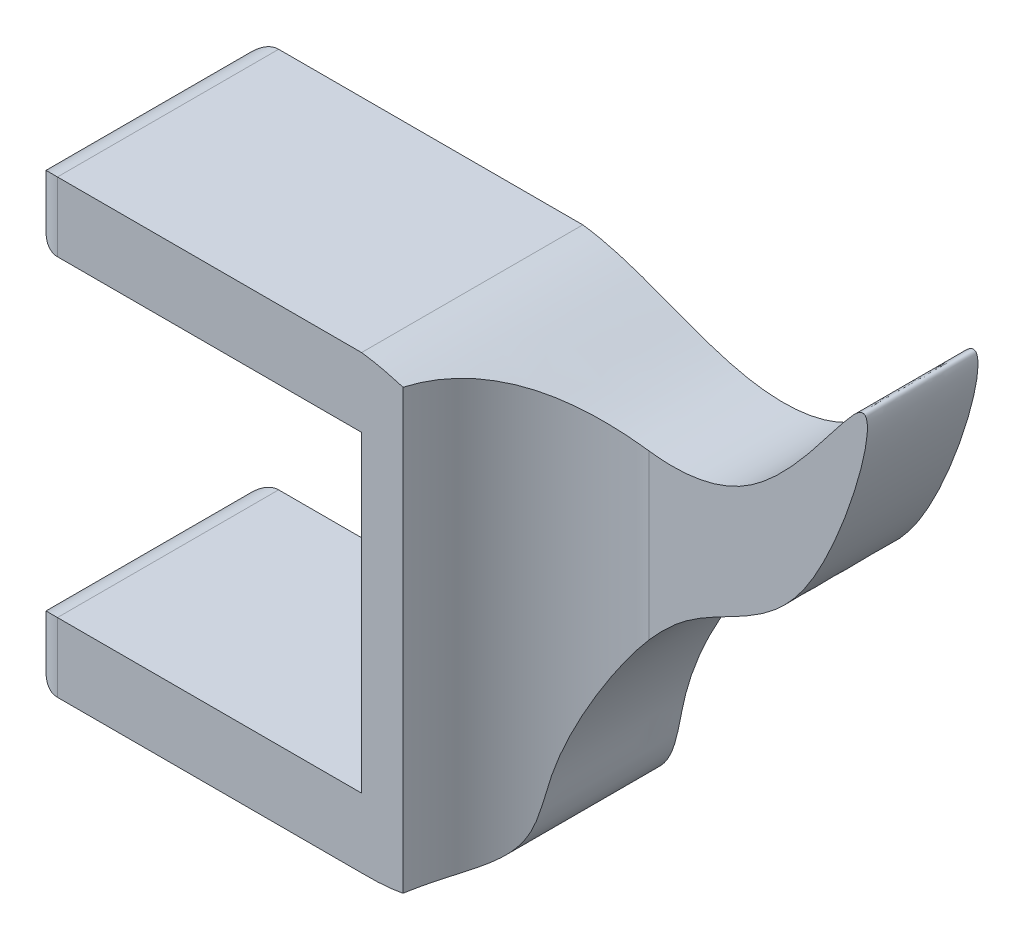
ISO-10303-21;
HEADER;
FILE_DESCRIPTION(('STEP AP214'),'2;1');
FILE_NAME('part.step','',(''),(''),'','','');
FILE_SCHEMA(('AUTOMOTIVE_DESIGN { 1 0 10303 214 1 1 1 1 }'));
ENDSEC;
DATA;
#1=APPLICATION_CONTEXT('core data for automotive mechanical design processes');
#2=APPLICATION_PROTOCOL_DEFINITION('international standard','automotive_design',2000,#1);
#3=PRODUCT_CONTEXT('',#1,'mechanical');
#4=PRODUCT('Part','Part','',(#3));
#5=PRODUCT_RELATED_PRODUCT_CATEGORY('part','',(#4));
#6=PRODUCT_DEFINITION_FORMATION('','',#4);
#7=PRODUCT_DEFINITION_CONTEXT('part definition',#1,'design');
#8=PRODUCT_DEFINITION('design','',#6,#7);
#9=PRODUCT_DEFINITION_SHAPE('','',#8);
#10=(LENGTH_UNIT() NAMED_UNIT(*) SI_UNIT(.MILLI.,.METRE.));
#11=(NAMED_UNIT(*) PLANE_ANGLE_UNIT() SI_UNIT($,.RADIAN.));
#12=(NAMED_UNIT(*) SI_UNIT($,.STERADIAN.) SOLID_ANGLE_UNIT());
#13=UNCERTAINTY_MEASURE_WITH_UNIT(LENGTH_MEASURE(1.E-05),#10,'distance_accuracy_value','');
#14=(GEOMETRIC_REPRESENTATION_CONTEXT(3) GLOBAL_UNCERTAINTY_ASSIGNED_CONTEXT((#13)) GLOBAL_UNIT_ASSIGNED_CONTEXT((#10,
#11,#12)) REPRESENTATION_CONTEXT('',''));
#15=CARTESIAN_POINT('',(0.,0.,0.));
#16=DIRECTION('',(0.,0.,1.));
#17=DIRECTION('',(1.,0.,0.));
#18=AXIS2_PLACEMENT_3D('',#15,#16,#17);
#19=CARTESIAN_POINT('',(0.,0.,8.));
#20=DIRECTION('',(1.,0.,0.));
#21=DIRECTION('',(0.,0.,-1.));
#22=AXIS2_PLACEMENT_3D('',#19,#20,#21);
#23=PLANE('',#22);
#24=DIRECTION('',(0.,-1.,0.));
#25=VECTOR('',#24,1.);
#26=CARTESIAN_POINT('',(0.,2.5,7.));
#27=LINE('',#26,#25);
#28=CARTESIAN_POINT('',(0.,1.,7.));
#29=VERTEX_POINT('',#28);
#30=CARTESIAN_POINT('',(0.,1.5,7.));
#31=VERTEX_POINT('',#30);
#32=EDGE_CURVE('E223',#29,#31,#27,.F.);
#33=ORIENTED_EDGE('',*,*,#32,.T.);
#34=DIRECTION('',(0.,0.,-1.));
#35=VECTOR('',#34,1.);
#36=CARTESIAN_POINT('',(0.,1.5,8.));
#37=LINE('',#36,#35);
#38=CARTESIAN_POINT('',(0.,1.5,1.));
#39=VERTEX_POINT('',#38);
#40=EDGE_CURVE('E226',#31,#39,#37,.T.);
#41=ORIENTED_EDGE('',*,*,#40,.T.);
#42=DIRECTION('',(0.,-1.,0.));
#43=VECTOR('',#42,1.);
#44=CARTESIAN_POINT('',(0.,0.,1.));
#45=LINE('',#44,#43);
#46=CARTESIAN_POINT('',(0.,1.,1.));
#47=VERTEX_POINT('',#46);
#48=EDGE_CURVE('E217',#39,#47,#45,.T.);
#49=ORIENTED_EDGE('',*,*,#48,.T.);
#50=DIRECTION('',(0.,0.,-1.));
#51=VECTOR('',#50,1.);
#52=CARTESIAN_POINT('',(0.,1.,8.));
#53=LINE('',#52,#51);
#54=EDGE_CURVE('E220',#47,#29,#53,.F.);
#55=ORIENTED_EDGE('',*,*,#54,.T.);
#56=EDGE_LOOP('',(#33,#41,#49,#55));
#57=FACE_BOUND('',#56,.T.);
#58=ADVANCED_FACE('F39',(#57),#23,.F.);
#59=CARTESIAN_POINT('',(0.,0.,8.));
#60=DIRECTION('',(0.,1.,0.));
#61=DIRECTION('',(0.,0.,1.));
#62=AXIS2_PLACEMENT_3D('',#59,#60,#61);
#63=PLANE('',#62);
#64=DIRECTION('',(1.,0.,0.));
#65=VECTOR('',#64,1.);
#66=CARTESIAN_POINT('',(0.,0.,8.));
#67=LINE('',#66,#65);
#68=CARTESIAN_POINT('',(1.,0.,8.));
#69=VERTEX_POINT('',#68);
#70=CARTESIAN_POINT('',(12.,0.,8.));
#71=VERTEX_POINT('',#70);
#72=EDGE_CURVE('E329',#69,#71,#67,.T.);
#73=ORIENTED_EDGE('',*,*,#72,.F.);
#74=DIRECTION('',(0.,0.,-1.));
#75=VECTOR('',#74,1.);
#76=CARTESIAN_POINT('',(1.,0.,8.));
#77=LINE('',#76,#75);
#78=CARTESIAN_POINT('',(1.,0.,0.));
#79=VERTEX_POINT('',#78);
#80=EDGE_CURVE('E234',#69,#79,#77,.T.);
#81=ORIENTED_EDGE('',*,*,#80,.T.);
#82=DIRECTION('',(1.,0.,0.));
#83=VECTOR('',#82,1.);
#84=CARTESIAN_POINT('',(0.,0.,0.));
#85=LINE('',#84,#83);
#86=CARTESIAN_POINT('',(12.5,0.,0.));
#87=VERTEX_POINT('',#86);
#88=EDGE_CURVE('E253',#79,#87,#85,.T.);
#89=ORIENTED_EDGE('',*,*,#88,.T.);
#90=CARTESIAN_POINT('',(12.5,0.,0.5));
#91=DIRECTION('',(0.,1.,0.));
#92=DIRECTION('',(0.,0.,1.));
#93=AXIS2_PLACEMENT_3D('',#90,#91,#92);
#94=CIRCLE('',#93,0.5);
#95=CARTESIAN_POINT('',(12.,0.,0.5));
#96=VERTEX_POINT('',#95);
#97=EDGE_CURVE('E278',#87,#96,#94,.T.);
#98=ORIENTED_EDGE('',*,*,#97,.T.);
#99=DIRECTION('',(0.,0.,-1.));
#100=VECTOR('',#99,1.);
#101=CARTESIAN_POINT('',(12.,0.,8.));
#102=LINE('',#101,#100);
#103=EDGE_CURVE('E170',#71,#96,#102,.T.);
#104=ORIENTED_EDGE('',*,*,#103,.F.);
#105=EDGE_LOOP('',(#73,#81,#89,#98,#104));
#106=FACE_BOUND('',#105,.T.);
#107=ADVANCED_FACE('F393',(#106),#63,.F.);
#108=CARTESIAN_POINT('',(12.,0.,8.));
#109=DIRECTION('',(1.,0.,0.));
#110=DIRECTION('',(0.,0.,-1.));
#111=AXIS2_PLACEMENT_3D('',#108,#109,#110);
#112=PLANE('',#111);
#113=ORIENTED_EDGE('',*,*,#103,.T.);
#114=DIRECTION('',(0.,-1.,0.));
#115=VECTOR('',#114,1.);
#116=CARTESIAN_POINT('',(12.,0.,0.5));
#117=LINE('',#116,#115);
#118=CARTESIAN_POINT('',(12.,-11.3,0.5));
#119=VERTEX_POINT('',#118);
#120=EDGE_CURVE('E237',#96,#119,#117,.T.);
#121=ORIENTED_EDGE('',*,*,#120,.T.);
#122=DIRECTION('',(0.,0.,-1.));
#123=VECTOR('',#122,1.);
#124=CARTESIAN_POINT('',(12.,-11.3,8.));
#125=LINE('',#124,#123);
#126=CARTESIAN_POINT('',(12.,-11.3,8.));
#127=VERTEX_POINT('',#126);
#128=EDGE_CURVE('E177',#127,#119,#125,.T.);
#129=ORIENTED_EDGE('',*,*,#128,.F.);
#130=DIRECTION('',(0.,-1.,0.));
#131=VECTOR('',#130,1.);
#132=CARTESIAN_POINT('',(12.,0.,8.));
#133=LINE('',#132,#131);
#134=EDGE_CURVE('E346',#71,#127,#133,.T.);
#135=ORIENTED_EDGE('',*,*,#134,.F.);
#136=EDGE_LOOP('',(#113,#121,#129,#135));
#137=FACE_BOUND('',#136,.T.);
#138=ADVANCED_FACE('F345',(#137),#112,.F.);
#139=CARTESIAN_POINT('',(12.,-11.3,8.));
#140=DIRECTION('',(0.,-1.,0.));
#141=DIRECTION('',(1.,0.,0.));
#142=AXIS2_PLACEMENT_3D('',#139,#140,#141);
#143=PLANE('',#142);
#144=DIRECTION('',(-1.,0.,0.));
#145=VECTOR('',#144,1.);
#146=CARTESIAN_POINT('',(12.,-11.3,0.));
#147=LINE('',#146,#145);
#148=CARTESIAN_POINT('',(12.5,-11.3,0.));
#149=VERTEX_POINT('',#148);
#150=CARTESIAN_POINT('',(1.,-11.3,0.));
#151=VERTEX_POINT('',#150);
#152=EDGE_CURVE('E310',#149,#151,#147,.T.);
#153=ORIENTED_EDGE('',*,*,#152,.T.);
#154=DIRECTION('',(0.,0.,-1.));
#155=VECTOR('',#154,1.);
#156=CARTESIAN_POINT('',(1.,-11.3,8.));
#157=LINE('',#156,#155);
#158=CARTESIAN_POINT('',(1.,-11.3,8.));
#159=VERTEX_POINT('',#158);
#160=EDGE_CURVE('E198',#151,#159,#157,.F.);
#161=ORIENTED_EDGE('',*,*,#160,.T.);
#162=DIRECTION('',(-1.,0.,0.));
#163=VECTOR('',#162,1.);
#164=CARTESIAN_POINT('',(12.,-11.3,8.));
#165=LINE('',#164,#163);
#166=EDGE_CURVE('E342',#127,#159,#165,.T.);
#167=ORIENTED_EDGE('',*,*,#166,.F.);
#168=ORIENTED_EDGE('',*,*,#128,.T.);
#169=CARTESIAN_POINT('',(12.5,-11.3,0.5));
#170=DIRECTION('',(0.,-1.,0.));
#171=DIRECTION('',(1.,0.,0.));
#172=AXIS2_PLACEMENT_3D('',#169,#170,#171);
#173=CIRCLE('',#172,0.5);
#174=EDGE_CURVE('E274',#119,#149,#173,.T.);
#175=ORIENTED_EDGE('',*,*,#174,.T.);
#176=EDGE_LOOP('',(#153,#161,#167,#168,#175));
#177=FACE_BOUND('',#176,.T.);
#178=ADVANCED_FACE('F340',(#177),#143,.F.);
#179=CARTESIAN_POINT('',(0.,-11.3,8.));
#180=DIRECTION('',(1.,0.,0.));
#181=DIRECTION('',(0.,1.,0.));
#182=AXIS2_PLACEMENT_3D('',#179,#180,#181);
#183=PLANE('',#182);
#184=DIRECTION('',(0.,-1.,0.));
#185=VECTOR('',#184,1.);
#186=CARTESIAN_POINT('',(0.,-11.3,7.));
#187=LINE('',#186,#185);
#188=CARTESIAN_POINT('',(0.,-12.8,7.));
#189=VERTEX_POINT('',#188);
#190=CARTESIAN_POINT('',(0.,-12.3,7.));
#191=VERTEX_POINT('',#190);
#192=EDGE_CURVE('E191',#189,#191,#187,.F.);
#193=ORIENTED_EDGE('',*,*,#192,.T.);
#194=DIRECTION('',(0.,0.,-1.));
#195=VECTOR('',#194,1.);
#196=CARTESIAN_POINT('',(0.,-12.3,8.));
#197=LINE('',#196,#195);
#198=CARTESIAN_POINT('',(0.,-12.3,1.));
#199=VERTEX_POINT('',#198);
#200=EDGE_CURVE('E194',#191,#199,#197,.T.);
#201=ORIENTED_EDGE('',*,*,#200,.T.);
#202=DIRECTION('',(0.,-1.,0.));
#203=VECTOR('',#202,1.);
#204=CARTESIAN_POINT('',(0.,-11.3,1.));
#205=LINE('',#204,#203);
#206=CARTESIAN_POINT('',(0.,-12.8,1.));
#207=VERTEX_POINT('',#206);
#208=EDGE_CURVE('E174',#199,#207,#205,.T.);
#209=ORIENTED_EDGE('',*,*,#208,.T.);
#210=DIRECTION('',(0.,0.,-1.));
#211=VECTOR('',#210,1.);
#212=CARTESIAN_POINT('',(0.,-12.8,8.));
#213=LINE('',#212,#211);
#214=EDGE_CURVE('E188',#207,#189,#213,.F.);
#215=ORIENTED_EDGE('',*,*,#214,.T.);
#216=EDGE_LOOP('',(#193,#201,#209,#215));
#217=FACE_BOUND('',#216,.T.);
#218=ADVANCED_FACE('F371',(#217),#183,.F.);
#219=CARTESIAN_POINT('',(0.,-13.8,8.));
#220=DIRECTION('',(0.,1.,0.));
#221=DIRECTION('',(0.,0.,1.));
#222=AXIS2_PLACEMENT_3D('',#219,#220,#221);
#223=PLANE('',#222);
#224=DIRECTION('',(1.,0.,0.));
#225=VECTOR('',#224,1.);
#226=CARTESIAN_POINT('',(0.,-13.8,8.));
#227=LINE('',#226,#225);
#228=CARTESIAN_POINT('',(1.,-13.8,8.));
#229=VERTEX_POINT('',#228);
#230=CARTESIAN_POINT('',(12.,-13.8,8.));
#231=VERTEX_POINT('',#230);
#232=EDGE_CURVE('E163',#229,#231,#227,.T.);
#233=ORIENTED_EDGE('',*,*,#232,.F.);
#234=DIRECTION('',(0.,0.,-1.));
#235=VECTOR('',#234,1.);
#236=CARTESIAN_POINT('',(1.,-13.8,8.));
#237=LINE('',#236,#235);
#238=CARTESIAN_POINT('',(1.,-13.8,0.));
#239=VERTEX_POINT('',#238);
#240=EDGE_CURVE('E208',#229,#239,#237,.T.);
#241=ORIENTED_EDGE('',*,*,#240,.T.);
#242=DIRECTION('',(1.,0.,0.));
#243=VECTOR('',#242,1.);
#244=CARTESIAN_POINT('',(0.,-13.8,0.));
#245=LINE('',#244,#243);
#246=CARTESIAN_POINT('',(12.,-13.8,0.));
#247=VERTEX_POINT('',#246);
#248=EDGE_CURVE('E314',#239,#247,#245,.T.);
#249=ORIENTED_EDGE('',*,*,#248,.T.);
#250=DIRECTION('',(0.,0.,-1.));
#251=VECTOR('',#250,1.);
#252=CARTESIAN_POINT('',(12.,-13.8,8.));
#253=LINE('',#252,#251);
#254=EDGE_CURVE('E333',#231,#247,#253,.T.);
#255=ORIENTED_EDGE('',*,*,#254,.F.);
#256=EDGE_LOOP('',(#233,#241,#249,#255));
#257=FACE_BOUND('',#256,.T.);
#258=ADVANCED_FACE('F291',(#257),#223,.F.);
#259=CARTESIAN_POINT('',(12.,-13.8,8.));
#260=CARTESIAN_POINT('',(15.4847102523201,-13.8528468301209,8.));
#261=CARTESIAN_POINT('',(14.940540429152,-10.3224990222861,8.));
#262=CARTESIAN_POINT('',(19.3306872790784,-3.08840811438823,8.));
#263=CARTESIAN_POINT('',(24.4500588762761,-2.75205545765976,8.));
#264=CARTESIAN_POINT('',(27.7590084837071,9.33411750310438,8.));
#265=CARTESIAN_POINT('',(22.7397639869143,0.637931927937077,8.));
#266=CARTESIAN_POINT('',(17.1583996594228,0.302540020179991,8.));
#267=CARTESIAN_POINT('',(14.0891624826578,2.22940097290657,8.));
#268=CARTESIAN_POINT('',(12.,2.5,8.));
#269=B_SPLINE_CURVE_WITH_KNOTS('',3,(#259,#260,#261,#262,#263,#264,#265,#266,#267,#268),
.UNSPECIFIED.,.F.,.F.,(4,1,1,1,1,1,1,4),(0.,0.147276447844875,0.328233881234076,
0.48848936607897,0.668662232198369,0.788034841795962,0.87120045565876,1.),.UNSPECIFIED.);
#270=DIRECTION('',(0.,0.,-1.));
#271=VECTOR('',#270,1.);
#272=SURFACE_OF_LINEAR_EXTRUSION('',#269,#271);
#273=CARTESIAN_POINT('',(13.5000000137224,2.16422625637094,8.));
#274=VERTEX_POINT('',#273);
#275=CARTESIAN_POINT('',(12.,2.5,8.));
#276=VERTEX_POINT('',#275);
#277=EDGE_CURVE('E167',#274,#276,#269,.T.);
#278=ORIENTED_EDGE('',*,*,#277,.F.);
#279=CARTESIAN_POINT('',(13.5000000137224,2.16422625637094,8.));
#280=CARTESIAN_POINT('',(13.527177423667,2.1559474382016,7.8667599511038));
#281=CARTESIAN_POINT('',(13.5598062480283,2.14592473446505,7.73474310946525));
#282=CARTESIAN_POINT('',(13.6355746879105,2.12223453789105,7.47411105241857));
#283=CARTESIAN_POINT('',(13.6787131865118,2.10856743234925,7.34549547714862));
#284=CARTESIAN_POINT('',(13.7749779185704,2.07747395978039,7.09295175546111));
#285=CARTESIAN_POINT('',(13.8280754246414,2.06005838464433,6.9690113285852));
#286=CARTESIAN_POINT('',(13.9438234889711,2.02133226056555,6.72631216345148));
#287=CARTESIAN_POINT('',(14.0064738994083,2.00002177189168,6.60755334505006));
#288=CARTESIAN_POINT('',(14.1407516897043,1.95347114498519,6.37599253322812));
#289=CARTESIAN_POINT('',(14.212381436241,1.92822997031772,6.26319212144317));
#290=CARTESIAN_POINT('',(14.3639449279196,1.87391481943308,6.04429022146097));
#291=CARTESIAN_POINT('',(14.4438790435895,1.84484067217897,5.93818903251265));
#292=CARTESIAN_POINT('',(14.6113427386662,1.7831064815339,5.73330238932791));
#293=CARTESIAN_POINT('',(14.6988715102584,1.7504468194227,5.63451615909381));
#294=CARTESIAN_POINT('',(14.880839166275,1.68194356017544,5.44472582189096));
#295=CARTESIAN_POINT('',(14.975278194048,1.64609989698614,5.35372187644538));
#296=CARTESIAN_POINT('',(15.1732026554132,1.57073255742882,5.17737895806739));
#297=CARTESIAN_POINT('',(15.2768694918933,1.53113298578407,5.09227621152031));
#298=CARTESIAN_POINT('',(15.490188806769,1.44994906837441,4.93099281149258));
#299=CARTESIAN_POINT('',(15.5998414862946,1.40836465592291,4.85481245808356));
#300=CARTESIAN_POINT('',(15.824826545937,1.32406502888191,4.71146092967336));
#301=CARTESIAN_POINT('',(15.9401704209302,1.28134761364059,4.64430910122109));
#302=CARTESIAN_POINT('',(16.175866525876,1.1959583993154,4.51942437051432));
#303=CARTESIAN_POINT('',(16.2962189023101,1.15328660160316,4.46169174398257));
#304=CARTESIAN_POINT('',(16.5534325951706,1.0651325725778,4.35076038501276));
#305=CARTESIAN_POINT('',(16.6907634090455,1.01977880748943,4.29854343573643));
#306=CARTESIAN_POINT('',(16.9704998860226,0.932360556264356,4.20613454574612));
#307=CARTESIAN_POINT('',(17.1129071448996,0.89029711795058,4.16594642425651));
#308=CARTESIAN_POINT('',(17.4015051355064,0.811547913322285,4.09827343904451));
#309=CARTESIAN_POINT('',(17.5476775927863,0.774840432257285,4.07073624916871));
#310=CARTESIAN_POINT('',(17.8433923472349,0.70856896438915,4.02872521268173));
#311=CARTESIAN_POINT('',(17.9929307246273,0.678997095150161,4.01423690266246));
#312=CARTESIAN_POINT('',(18.1859260355537,0.64676325715664,4.00436001162303));
#313=CARTESIAN_POINT('',(18.2284500013433,0.640026251191426,4.00272703526753));
#314=CARTESIAN_POINT('',(18.3136238072751,0.627281942764177,4.00054736157709));
#315=CARTESIAN_POINT('',(18.3562736128671,0.621274456206925,4.00000038965042));
#316=CARTESIAN_POINT('',(18.3989794853852,0.615643027872547,4.));
#317=B_SPLINE_CURVE_WITH_KNOTS('',3,(#279,#280,#281,#282,#283,#284,#285,#286,#287,#288,#289,
#290,#291,#292,#293,#294,#295,#296,#297,#298,#299,#300,#301,#302,#303,#304,#305,#306,#307,#308,
#309,#310,#311,#312,#313,#314,#315,#316),.UNSPECIFIED.,.F.,.F.,(4,2,2,2,2,2,2,2,2,2,2,2,2,2,2,2,
2,2,4),(0.,0.408578126374839,0.817112849876771,1.22448676459235,1.63185437624632,
2.03932958416367,2.44682298081449,2.85427308695506,3.26173164776775,3.68083492263619,
4.09995228844456,4.51995390295257,4.9399678097158,5.40069073315524,5.86155978406703,
6.32050505859989,6.77894100886525,6.90818272967927,7.03739176809311),.UNSPECIFIED.);
#318=CARTESIAN_POINT('',(18.3989794771545,0.61564302895761,4.));
#319=VERTEX_POINT('',#318);
#320=EDGE_CURVE('E11',#274,#319,#317,.T.);
#321=ORIENTED_EDGE('',*,*,#320,.T.);
#322=CARTESIAN_POINT('',(12.,-13.8,4.));
#323=CARTESIAN_POINT('',(15.4847102523201,-13.8528468301209,4.));
#324=CARTESIAN_POINT('',(14.940540429152,-10.3224990222861,4.));
#325=CARTESIAN_POINT('',(19.3306872790784,-3.08840811438823,4.));
#326=CARTESIAN_POINT('',(24.4500588762761,-2.75205545765976,4.));
#327=CARTESIAN_POINT('',(27.7590084837071,9.33411750310438,4.));
#328=CARTESIAN_POINT('',(22.7397639869143,0.637931927937077,4.));
#329=CARTESIAN_POINT('',(17.1583996594228,0.302540020179991,4.));
#330=CARTESIAN_POINT('',(14.0891624826578,2.22940097290657,4.));
#331=CARTESIAN_POINT('',(12.,2.5,4.));
#332=B_SPLINE_CURVE_WITH_KNOTS('',3,(#322,#323,#324,#325,#326,#327,#328,#329,#330,#331),
.UNSPECIFIED.,.F.,.F.,(4,1,1,1,1,1,1,4),(0.,0.147276447844875,0.328233881234076,
0.48848936607897,0.668662232198369,0.788034841795962,0.87120045565876,1.),.UNSPECIFIED.);
#333=CARTESIAN_POINT('',(18.3989794788807,-5.29838820308295,4.));
#334=VERTEX_POINT('',#333);
#335=EDGE_CURVE('E155',#319,#334,#332,.F.);
#336=ORIENTED_EDGE('',*,*,#335,.T.);
#337=CARTESIAN_POINT('',(18.3989794855664,-5.29838820308295,4.));
#338=CARTESIAN_POINT('',(18.3039210325966,-5.40871834029973,4.00001772219593));
#339=CARTESIAN_POINT('',(18.211098963984,-5.52092115523218,4.00271078598421));
#340=CARTESIAN_POINT('',(18.0299666691016,-5.74833899040509,4.01280777244988));
#341=CARTESIAN_POINT('',(17.9416476287125,-5.86354740195227,4.02020207805254));
#342=CARTESIAN_POINT('',(17.7692406813389,-6.09660718542812,4.0390596493651));
#343=CARTESIAN_POINT('',(17.685149555651,-6.2144564449496,4.05051976454279));
#344=CARTESIAN_POINT('',(17.5210222364878,-6.45253501203465,4.0769823966913));
#345=CARTESIAN_POINT('',(17.4409856928237,-6.57276411280285,4.09198460710038));
#346=CARTESIAN_POINT('',(17.2844803503467,-6.8159787548189,4.1251337512948));
#347=CARTESIAN_POINT('',(17.2080320600542,-6.93897530705882,4.14329649058672));
#348=CARTESIAN_POINT('',(17.059079207944,-7.1869833876033,4.18226244525458));
#349=CARTESIAN_POINT('',(16.9865761570342,-7.31199566443912,4.20306666221037));
#350=CARTESIAN_POINT('',(16.8455347768711,-7.56389046211622,4.24686813278035));
#351=CARTESIAN_POINT('',(16.7769972591392,-7.69077335914857,4.26986583274469));
#352=CARTESIAN_POINT('',(16.6439633986098,-7.946297889386,4.31759559406989));
#353=CARTESIAN_POINT('',(16.5794665717292,-8.07493930965828,4.34232744692045));
#354=CARTESIAN_POINT('',(16.4566059900929,-8.32984040044568,4.39224135399812));
#355=CARTESIAN_POINT('',(16.3981122368759,-8.45604518215839,4.41738389340823));
#356=CARTESIAN_POINT('',(16.285179816453,-8.7100833632706,4.46836813124184));
#357=CARTESIAN_POINT('',(16.2307402339509,-8.83791638738895,4.49420967004771));
#358=CARTESIAN_POINT('',(16.1261264724265,-9.09531870658596,4.54606379975746));
#359=CARTESIAN_POINT('',(16.0759532723309,-9.22488839229103,4.57207642845093));
#360=CARTESIAN_POINT('',(15.9803855367852,-9.48536876663402,4.62354748409946));
#361=CARTESIAN_POINT('',(15.9349749785617,-9.61627321911792,4.649007524707));
#362=CARTESIAN_POINT('',(15.8706519014133,-9.81401575706534,4.68628060617999));
#363=CARTESIAN_POINT('',(15.8498446984313,-9.88015491925205,4.69855107741842));
#364=CARTESIAN_POINT('',(15.8095709633891,-10.0129166985362,4.72267437965749));
#365=CARTESIAN_POINT('',(15.7901044212769,-10.0795393120047,4.73452721378914));
#366=CARTESIAN_POINT('',(15.752600575547,-10.2132237242435,4.75769365959138));
#367=CARTESIAN_POINT('',(15.7345621931899,-10.2802851492985,4.76900767562573));
#368=CARTESIAN_POINT('',(15.7000498321067,-10.4149215754794,4.79093844193513));
#369=CARTESIAN_POINT('',(15.6835758171119,-10.4824965646593,4.80155520837363));
#370=CARTESIAN_POINT('',(15.6580106183437,-10.5922620381389,4.81822697720916));
#371=CARTESIAN_POINT('',(15.6484959132192,-10.6343251052583,4.82448026832522));
#372=CARTESIAN_POINT('',(15.6298862206177,-10.7185713237731,4.83679851453428));
#373=CARTESIAN_POINT('',(15.6207912326929,-10.7607544750403,4.84286346982819));
#374=CARTESIAN_POINT('',(15.5939898343788,-10.8874739538002,4.86085762544765));
#375=CARTESIAN_POINT('',(15.5767755416216,-10.9721427931812,4.87258052114523));
#376=CARTESIAN_POINT('',(15.5427681449131,-11.1416379005041,4.8960405023143));
#377=CARTESIAN_POINT('',(15.5259754187659,-11.2264642412846,4.90777759128051));
#378=CARTESIAN_POINT('',(15.4918041256159,-11.3959243656551,4.9319818610704));
#379=CARTESIAN_POINT('',(15.4744254041277,-11.4805580920886,4.94444923506744));
#380=CARTESIAN_POINT('',(15.437927806815,-11.6491326284871,4.97101955812722));
#381=CARTESIAN_POINT('',(15.418810328095,-11.7330739366819,4.98512119650174));
#382=CARTESIAN_POINT('',(15.3775129672407,-11.8996393165859,5.01610582244626));
#383=CARTESIAN_POINT('',(15.3553359885981,-11.9822645552976,5.03298617589202));
#384=CARTESIAN_POINT('',(15.3142078307359,-12.1195534255257,5.064949023961));
#385=CARTESIAN_POINT('',(15.2964419659753,-12.1748243873715,5.07892212579397));
#386=CARTESIAN_POINT('',(15.2583951299215,-12.2838295897674,5.10932843816428));
#387=CARTESIAN_POINT('',(15.2381138502883,-12.3375636409274,5.1257619503505));
#388=CARTESIAN_POINT('',(15.1948087883597,-12.4426717475032,5.16150101895685));
#389=CARTESIAN_POINT('',(15.1717964817392,-12.4940545032741,5.18079463695825));
#390=CARTESIAN_POINT('',(15.1228340255331,-12.5939953382267,5.22271150788386));
#391=CARTESIAN_POINT('',(15.0968842944099,-12.6425538182635,5.24533428667679));
#392=CARTESIAN_POINT('',(15.0417803434647,-12.7368171307524,5.29451831648161));
#393=CARTESIAN_POINT('',(15.0125863448007,-12.7824724910247,5.32113027490426));
#394=CARTESIAN_POINT('',(14.9517095867508,-12.8695875600789,5.37811295189075));
#395=CARTESIAN_POINT('',(14.9200268444575,-12.9110472976715,5.40848364464074));
#396=CARTESIAN_POINT('',(14.8547236298683,-12.9895460120567,5.47291098557733));
#397=CARTESIAN_POINT('',(14.8210985986265,-13.0265739047572,5.50697648539461));
#398=CARTESIAN_POINT('',(14.7527048974874,-13.0960799277934,5.57843186555955));
#399=CARTESIAN_POINT('',(14.7179359931751,-13.1285571182879,5.61582243002288));
#400=CARTESIAN_POINT('',(14.6419766923933,-13.1943753917638,5.70020076265874));
#401=CARTESIAN_POINT('',(14.6007041137684,-13.2269160047798,5.74773677243589));
#402=CARTESIAN_POINT('',(14.5184975873786,-13.286720120747,5.84627487361894));
#403=CARTESIAN_POINT('',(14.4775637263174,-13.3139823102515,5.89727782345972));
#404=CARTESIAN_POINT('',(14.3966631544584,-13.3640239303737,6.0023558118446));
#405=CARTESIAN_POINT('',(14.356698828366,-13.3867931312108,6.05643750781645));
#406=CARTESIAN_POINT('',(14.2783399573249,-13.4284922540395,6.16716793754434));
#407=CARTESIAN_POINT('',(14.2399459989836,-13.4474207516155,6.22381761420201));
#408=CARTESIAN_POINT('',(14.1424701385386,-13.4925624016716,6.37429760066731));
#409=CARTESIAN_POINT('',(14.0849253624516,-13.5162543558876,6.46988677240985));
#410=CARTESIAN_POINT('',(13.9758775076141,-13.5575081040095,6.66574242614701));
#411=CARTESIAN_POINT('',(13.9243781879633,-13.5750660970493,6.76601176471235));
#412=CARTESIAN_POINT('',(13.8280665560054,-13.6055689041653,6.97034280360635));
#413=CARTESIAN_POINT('',(13.7832524195053,-13.6185149780442,7.07440345971549));
#414=CARTESIAN_POINT('',(13.7007151490159,-13.640905551222,7.28560146432073));
#415=CARTESIAN_POINT('',(13.6629885472379,-13.6503517651434,7.39273727846753));
#416=CARTESIAN_POINT('',(13.603162604562,-13.66457657878,7.58312604762927));
#417=CARTESIAN_POINT('',(13.5794943328332,-13.6699316403861,7.66584822654884));
#418=CARTESIAN_POINT('',(13.5365034688604,-13.6793233206232,7.83222692627234));
#419=CARTESIAN_POINT('',(13.5171682402415,-13.6833637889711,7.91587996323462));
#420=CARTESIAN_POINT('',(13.5000000000003,-13.6868748578703,7.99999999999857));
#421=B_SPLINE_CURVE_WITH_KNOTS('',3,(#337,#338,#339,#340,#341,#342,#343,#344,#345,#346,#347,
#348,#349,#350,#351,#352,#353,#354,#355,#356,#357,#358,#359,#360,#361,#362,#363,#364,#365,#366,
#367,#368,#369,#370,#371,#372,#373,#374,#375,#376,#377,#378,#379,#380,#381,#382,#383,#384,#385,
#386,#387,#388,#389,#390,#391,#392,#393,#394,#395,#396,#397,#398,#399,#400,#401,#402,#403,#404,
#405,#406,#407,#408,#409,#410,#411,#412,#413,#414,#415,#416,#417,#418,#419,#420),.UNSPECIFIED.,
.F.,.F.,(4,2,2,2,2,2,2,2,2,2,2,2,2,2,2,2,2,2,2,2,2,2,2,2,2,2,2,2,2,2,2,2,2,2,2,2,2,2,2,2,2,4),
(0.,0.436784805682295,0.87267896672434,1.30823609529228,1.74375554101104,2.18151908834452,
2.61944912276284,3.05746846212293,3.49543522512298,3.91943386927847,4.3433364966925,
4.76733612808606,5.18986017968269,5.40108432253727,5.6123068815112,5.82336834358934,
6.03442491117136,6.16515259755628,6.29588014447485,6.55745185907962,6.81925017855971,
7.08111806383991,7.34277736451319,7.60419003488969,7.78323507994939,7.96230209412234,
8.14064167703611,8.31895588578119,8.49976664798758,8.68057616850923,8.86182884308714,
9.04311889617319,9.25538352079701,9.46770089620481,9.68049624195079,9.89337036419896,
10.235034845373,10.5769106626063,10.9186930205065,11.2603077131178,11.5188125941337,
11.7765534970975),.UNSPECIFIED.);
#422=CARTESIAN_POINT('',(13.5,-13.6868748578499,8.));
#423=VERTEX_POINT('',#422);
#424=EDGE_CURVE('E54',#334,#423,#421,.T.);
#425=ORIENTED_EDGE('',*,*,#424,.T.);
#426=EDGE_CURVE('E154',#231,#423,#269,.T.);
#427=ORIENTED_EDGE('',*,*,#426,.F.);
#428=ORIENTED_EDGE('',*,*,#254,.T.);
#429=CARTESIAN_POINT('',(12.,-13.8,0.));
#430=CARTESIAN_POINT('',(15.4847102523201,-13.8528468301209,0.));
#431=CARTESIAN_POINT('',(14.940540429152,-10.3224990222861,0.));
#432=CARTESIAN_POINT('',(19.3306872790784,-3.08840811438823,0.));
#433=CARTESIAN_POINT('',(24.4500588762761,-2.75205545765976,0.));
#434=CARTESIAN_POINT('',(27.7590084837071,9.33411750310438,0.));
#435=CARTESIAN_POINT('',(22.7397639869143,0.637931927937077,0.));
#436=CARTESIAN_POINT('',(17.1583996594228,0.302540020179991,0.));
#437=CARTESIAN_POINT('',(14.0891624826578,2.22940097290657,0.));
#438=CARTESIAN_POINT('',(12.,2.5,0.));
#439=B_SPLINE_CURVE_WITH_KNOTS('',3,(#429,#430,#431,#432,#433,#434,#435,#436,#437,#438),
.UNSPECIFIED.,.F.,.F.,(4,1,1,1,1,1,1,4),(0.,0.147276447844875,0.328233881234076,
0.48848936607897,0.668662232198369,0.788034841795962,0.87120045565876,1.),.UNSPECIFIED.);
#440=CARTESIAN_POINT('',(12.,2.5,0.));
#441=VERTEX_POINT('',#440);
#442=EDGE_CURVE('E317',#247,#441,#439,.T.);
#443=ORIENTED_EDGE('',*,*,#442,.T.);
#444=DIRECTION('',(0.,0.,-1.));
#445=VECTOR('',#444,1.);
#446=CARTESIAN_POINT('',(12.,2.5,8.));
#447=LINE('',#446,#445);
#448=EDGE_CURVE('E307',#276,#441,#447,.T.);
#449=ORIENTED_EDGE('',*,*,#448,.F.);
#450=EDGE_LOOP('',(#278,#321,#336,#425,#427,#428,#443,#449));
#451=FACE_BOUND('',#450,.T.);
#452=ADVANCED_FACE('F152',(#451),#272,.F.);
#453=CARTESIAN_POINT('',(0.,2.5,8.));
#454=DIRECTION('',(0.,-1.,0.));
#455=DIRECTION('',(0.,0.,-1.));
#456=AXIS2_PLACEMENT_3D('',#453,#454,#455);
#457=PLANE('',#456);
#458=DIRECTION('',(-1.,0.,0.));
#459=VECTOR('',#458,1.);
#460=CARTESIAN_POINT('',(0.,2.5,0.));
#461=LINE('',#460,#459);
#462=CARTESIAN_POINT('',(1.,2.5,0.));
#463=VERTEX_POINT('',#462);
#464=EDGE_CURVE('E322',#441,#463,#461,.T.);
#465=ORIENTED_EDGE('',*,*,#464,.T.);
#466=DIRECTION('',(0.,0.,-1.));
#467=VECTOR('',#466,1.);
#468=CARTESIAN_POINT('',(1.,2.5,8.));
#469=LINE('',#468,#467);
#470=CARTESIAN_POINT('',(1.,2.5,8.));
#471=VERTEX_POINT('',#470);
#472=EDGE_CURVE('E230',#463,#471,#469,.F.);
#473=ORIENTED_EDGE('',*,*,#472,.T.);
#474=DIRECTION('',(-1.,0.,0.));
#475=VECTOR('',#474,1.);
#476=CARTESIAN_POINT('',(0.,2.5,8.));
#477=LINE('',#476,#475);
#478=EDGE_CURVE('E166',#276,#471,#477,.T.);
#479=ORIENTED_EDGE('',*,*,#478,.F.);
#480=ORIENTED_EDGE('',*,*,#448,.T.);
#481=EDGE_LOOP('',(#465,#473,#479,#480));
#482=FACE_BOUND('',#481,.T.);
#483=ADVANCED_FACE('F290',(#482),#457,.F.);
#484=CARTESIAN_POINT('',(24.3495323207852,-0.363588990567902,8.));
#485=DIRECTION('',(0.,0.,1.));
#486=DIRECTION('',(1.,0.,0.));
#487=AXIS2_PLACEMENT_3D('',#484,#485,#486);
#488=PLANE('',#487);
#489=ORIENTED_EDGE('',*,*,#166,.T.);
#490=DIRECTION('',(0.,-1.,0.));
#491=VECTOR('',#490,1.);
#492=CARTESIAN_POINT('',(1.,-13.8,8.));
#493=LINE('',#492,#491);
#494=EDGE_CURVE('E205',#159,#229,#493,.T.);
#495=ORIENTED_EDGE('',*,*,#494,.T.);
#496=ORIENTED_EDGE('',*,*,#232,.T.);
#497=ORIENTED_EDGE('',*,*,#426,.T.);
#498=DIRECTION('',(0.,-1.,0.));
#499=VECTOR('',#498,1.);
#500=CARTESIAN_POINT('',(13.5,-0.363588990567902,8.));
#501=LINE('',#500,#499);
#502=EDGE_CURVE('E161',#274,#423,#501,.T.);
#503=ORIENTED_EDGE('',*,*,#502,.F.);
#504=ORIENTED_EDGE('',*,*,#277,.T.);
#505=ORIENTED_EDGE('',*,*,#478,.T.);
#506=DIRECTION('',(0.,-1.,0.));
#507=VECTOR('',#506,1.);
#508=CARTESIAN_POINT('',(1.,0.,8.));
#509=LINE('',#508,#507);
#510=EDGE_CURVE('E202',#471,#69,#509,.T.);
#511=ORIENTED_EDGE('',*,*,#510,.T.);
#512=ORIENTED_EDGE('',*,*,#72,.T.);
#513=ORIENTED_EDGE('',*,*,#134,.T.);
#514=EDGE_LOOP('',(#489,#495,#496,#497,#503,#504,#505,#511,#512,#513));
#515=FACE_BOUND('',#514,.T.);
#516=ADVANCED_FACE('F160',(#515),#488,.T.);
#517=CARTESIAN_POINT('',(24.3495323207852,-0.363588990567902,0.));
#518=DIRECTION('',(0.,0.,1.));
#519=DIRECTION('',(1.,0.,0.));
#520=AXIS2_PLACEMENT_3D('',#517,#518,#519);
#521=PLANE('',#520);
#522=ORIENTED_EDGE('',*,*,#152,.F.);
#523=DIRECTION('',(0.,-1.,0.));
#524=VECTOR('',#523,1.);
#525=CARTESIAN_POINT('',(12.5,-0.363588990567902,0.));
#526=LINE('',#525,#524);
#527=EDGE_CURVE('E270',#149,#87,#526,.F.);
#528=ORIENTED_EDGE('',*,*,#527,.T.);
#529=ORIENTED_EDGE('',*,*,#88,.F.);
#530=DIRECTION('',(0.,-1.,0.));
#531=VECTOR('',#530,1.);
#532=CARTESIAN_POINT('',(1.,-0.363588990567902,0.));
#533=LINE('',#532,#531);
#534=EDGE_CURVE('E211',#79,#463,#533,.F.);
#535=ORIENTED_EDGE('',*,*,#534,.T.);
#536=ORIENTED_EDGE('',*,*,#464,.F.);
#537=ORIENTED_EDGE('',*,*,#442,.F.);
#538=ORIENTED_EDGE('',*,*,#248,.F.);
#539=DIRECTION('',(0.,-1.,0.));
#540=VECTOR('',#539,1.);
#541=CARTESIAN_POINT('',(1.,-0.363588990567905,0.));
#542=LINE('',#541,#540);
#543=EDGE_CURVE('E214',#239,#151,#542,.F.);
#544=ORIENTED_EDGE('',*,*,#543,.T.);
#545=EDGE_LOOP('',(#522,#528,#529,#535,#536,#537,#538,#544));
#546=FACE_BOUND('',#545,.T.);
#547=ADVANCED_FACE('F354',(#546),#521,.F.);
#548=CARTESIAN_POINT('',(27.5264411120128,26.2,4.));
#549=DIRECTION('',(0.,0.,-1.));
#550=DIRECTION('',(-1.,0.,0.));
#551=AXIS2_PLACEMENT_3D('',#548,#549,#550);
#552=PLANE('',#551);
#553=ORIENTED_EDGE('',*,*,#335,.F.);
#554=DIRECTION('',(0.,1.,0.));
#555=VECTOR('',#554,1.);
#556=CARTESIAN_POINT('',(18.3989794855664,26.2,4.));
#557=LINE('',#556,#555);
#558=EDGE_CURVE('E157',#319,#334,#557,.F.);
#559=ORIENTED_EDGE('',*,*,#558,.T.);
#560=EDGE_LOOP('',(#553,#559));
#561=FACE_BOUND('',#560,.T.);
#562=ADVANCED_FACE('F382',(#561),#552,.F.);
#563=CARTESIAN_POINT('',(1.,-12.8,8.));
#564=DIRECTION('',(0.,0.,-1.));
#565=DIRECTION('',(-1.,0.,0.));
#566=AXIS2_PLACEMENT_3D('',#563,#564,#565);
#567=CYLINDRICAL_SURFACE('',#566,1.);
#568=CARTESIAN_POINT('',(1.,-12.8,1.));
#569=DIRECTION('',(0.,-0.707106781186547,0.707106781186547));
#570=DIRECTION('',(0.,-0.707106781186547,-0.707106781186547));
#571=AXIS2_PLACEMENT_3D('',#568,#569,#570);
#572=ELLIPSE('',#571,1.41421356237309,1.);
#573=EDGE_CURVE('E245',#239,#207,#572,.F.);
#574=ORIENTED_EDGE('',*,*,#573,.F.);
#575=ORIENTED_EDGE('',*,*,#240,.F.);
#576=CARTESIAN_POINT('',(1.,-12.8,7.));
#577=DIRECTION('',(0.,-0.707106781186547,-0.707106781186547));
#578=DIRECTION('',(0.,0.707106781186547,-0.707106781186547));
#579=AXIS2_PLACEMENT_3D('',#576,#577,#578);
#580=ELLIPSE('',#579,1.41421356237309,1.);
#581=EDGE_CURVE('E249',#189,#229,#580,.F.);
#582=ORIENTED_EDGE('',*,*,#581,.F.);
#583=ORIENTED_EDGE('',*,*,#214,.F.);
#584=EDGE_LOOP('',(#574,#575,#582,#583));
#585=FACE_BOUND('',#584,.T.);
#586=ADVANCED_FACE('F380',(#585),#567,.T.);
#587=CARTESIAN_POINT('',(1.,-0.363588990567905,7.));
#588=DIRECTION('',(0.,1.,0.));
#589=DIRECTION('',(-1.,0.,0.));
#590=AXIS2_PLACEMENT_3D('',#587,#588,#589);
#591=CYLINDRICAL_SURFACE('',#590,1.);
#592=ORIENTED_EDGE('',*,*,#581,.T.);
#593=ORIENTED_EDGE('',*,*,#494,.F.);
#594=CARTESIAN_POINT('',(1.,-12.3,7.));
#595=DIRECTION('',(0.,0.707106781186547,-0.707106781186547));
#596=DIRECTION('',(0.,0.707106781186547,0.707106781186547));
#597=AXIS2_PLACEMENT_3D('',#594,#595,#596);
#598=ELLIPSE('',#597,1.41421356237309,1.);
#599=EDGE_CURVE('E241',#191,#159,#598,.T.);
#600=ORIENTED_EDGE('',*,*,#599,.F.);
#601=ORIENTED_EDGE('',*,*,#192,.F.);
#602=EDGE_LOOP('',(#592,#593,#600,#601));
#603=FACE_BOUND('',#602,.T.);
#604=ADVANCED_FACE('F375',(#603),#591,.T.);
#605=CARTESIAN_POINT('',(1.,-11.3,1.));
#606=DIRECTION('',(0.,-1.,0.));
#607=DIRECTION('',(1.,0.,0.));
#608=AXIS2_PLACEMENT_3D('',#605,#606,#607);
#609=CYLINDRICAL_SURFACE('',#608,1.);
#610=ORIENTED_EDGE('',*,*,#573,.T.);
#611=ORIENTED_EDGE('',*,*,#208,.F.);
#612=CARTESIAN_POINT('',(1.,-12.3,1.));
#613=DIRECTION('',(0.,-0.707106781186547,-0.707106781186547));
#614=DIRECTION('',(0.,-0.707106781186547,0.707106781186547));
#615=AXIS2_PLACEMENT_3D('',#612,#613,#614);
#616=ELLIPSE('',#615,1.41421356237309,1.);
#617=EDGE_CURVE('E238',#151,#199,#616,.F.);
#618=ORIENTED_EDGE('',*,*,#617,.F.);
#619=ORIENTED_EDGE('',*,*,#543,.F.);
#620=EDGE_LOOP('',(#610,#611,#618,#619));
#621=FACE_BOUND('',#620,.T.);
#622=ADVANCED_FACE('F367',(#621),#609,.T.);
#623=CARTESIAN_POINT('',(1.,-12.3,8.));
#624=DIRECTION('',(0.,0.,-1.));
#625=DIRECTION('',(-1.,0.,0.));
#626=AXIS2_PLACEMENT_3D('',#623,#624,#625);
#627=CYLINDRICAL_SURFACE('',#626,1.);
#628=ORIENTED_EDGE('',*,*,#599,.T.);
#629=ORIENTED_EDGE('',*,*,#160,.F.);
#630=ORIENTED_EDGE('',*,*,#617,.T.);
#631=ORIENTED_EDGE('',*,*,#200,.F.);
#632=EDGE_LOOP('',(#628,#629,#630,#631));
#633=FACE_BOUND('',#632,.T.);
#634=ADVANCED_FACE('F361',(#633),#627,.T.);
#635=CARTESIAN_POINT('',(1.,1.,8.));
#636=DIRECTION('',(0.,0.,-1.));
#637=DIRECTION('',(-1.,0.,0.));
#638=AXIS2_PLACEMENT_3D('',#635,#636,#637);
#639=CYLINDRICAL_SURFACE('',#638,1.);
#640=CARTESIAN_POINT('',(1.,1.,1.));
#641=DIRECTION('',(0.,-0.707106781186547,0.707106781186547));
#642=DIRECTION('',(0.,-0.707106781186547,-0.707106781186547));
#643=AXIS2_PLACEMENT_3D('',#640,#641,#642);
#644=ELLIPSE('',#643,1.41421356237309,1.);
#645=EDGE_CURVE('E260',#79,#47,#644,.F.);
#646=ORIENTED_EDGE('',*,*,#645,.F.);
#647=ORIENTED_EDGE('',*,*,#80,.F.);
#648=CARTESIAN_POINT('',(1.,1.,7.));
#649=DIRECTION('',(0.,-0.707106781186547,-0.707106781186547));
#650=DIRECTION('',(0.,0.707106781186547,-0.707106781186547));
#651=AXIS2_PLACEMENT_3D('',#648,#649,#650);
#652=ELLIPSE('',#651,1.41421356237309,1.);
#653=EDGE_CURVE('E242',#29,#69,#652,.F.);
#654=ORIENTED_EDGE('',*,*,#653,.F.);
#655=ORIENTED_EDGE('',*,*,#54,.F.);
#656=EDGE_LOOP('',(#646,#647,#654,#655));
#657=FACE_BOUND('',#656,.T.);
#658=ADVANCED_FACE('F405',(#657),#639,.T.);
#659=CARTESIAN_POINT('',(1.,-0.363588990567902,7.));
#660=DIRECTION('',(0.,1.,0.));
#661=DIRECTION('',(0.,0.,1.));
#662=AXIS2_PLACEMENT_3D('',#659,#660,#661);
#663=CYLINDRICAL_SURFACE('',#662,1.);
#664=ORIENTED_EDGE('',*,*,#653,.T.);
#665=ORIENTED_EDGE('',*,*,#510,.F.);
#666=CARTESIAN_POINT('',(1.,1.5,7.));
#667=DIRECTION('',(0.,0.707106781186547,-0.707106781186547));
#668=DIRECTION('',(0.,0.707106781186547,0.707106781186547));
#669=AXIS2_PLACEMENT_3D('',#666,#667,#668);
#670=ELLIPSE('',#669,1.41421356237309,1.);
#671=EDGE_CURVE('E257',#31,#471,#670,.T.);
#672=ORIENTED_EDGE('',*,*,#671,.F.);
#673=ORIENTED_EDGE('',*,*,#32,.F.);
#674=EDGE_LOOP('',(#664,#665,#672,#673));
#675=FACE_BOUND('',#674,.T.);
#676=ADVANCED_FACE('F421',(#675),#663,.T.);
#677=CARTESIAN_POINT('',(1.,0.,1.));
#678=DIRECTION('',(0.,-1.,0.));
#679=DIRECTION('',(0.,0.,-1.));
#680=AXIS2_PLACEMENT_3D('',#677,#678,#679);
#681=CYLINDRICAL_SURFACE('',#680,1.);
#682=ORIENTED_EDGE('',*,*,#645,.T.);
#683=ORIENTED_EDGE('',*,*,#48,.F.);
#684=CARTESIAN_POINT('',(1.,1.5,1.));
#685=DIRECTION('',(0.,-0.707106781186547,-0.707106781186547));
#686=DIRECTION('',(0.,-0.707106781186547,0.707106781186547));
#687=AXIS2_PLACEMENT_3D('',#684,#685,#686);
#688=ELLIPSE('',#687,1.41421356237309,1.);
#689=EDGE_CURVE('E254',#463,#39,#688,.F.);
#690=ORIENTED_EDGE('',*,*,#689,.F.);
#691=ORIENTED_EDGE('',*,*,#534,.F.);
#692=EDGE_LOOP('',(#682,#683,#690,#691));
#693=FACE_BOUND('',#692,.T.);
#694=ADVANCED_FACE('F429',(#693),#681,.T.);
#695=CARTESIAN_POINT('',(1.,1.5,8.));
#696=DIRECTION('',(0.,0.,-1.));
#697=DIRECTION('',(-1.,0.,0.));
#698=AXIS2_PLACEMENT_3D('',#695,#696,#697);
#699=CYLINDRICAL_SURFACE('',#698,1.);
#700=ORIENTED_EDGE('',*,*,#671,.T.);
#701=ORIENTED_EDGE('',*,*,#472,.F.);
#702=ORIENTED_EDGE('',*,*,#689,.T.);
#703=ORIENTED_EDGE('',*,*,#40,.F.);
#704=EDGE_LOOP('',(#700,#701,#702,#703));
#705=FACE_BOUND('',#704,.T.);
#706=ADVANCED_FACE('F437',(#705),#699,.T.);
#707=CARTESIAN_POINT('',(12.5,0.,0.5));
#708=DIRECTION('',(0.,-1.,0.));
#709=DIRECTION('',(0.,0.,-1.));
#710=AXIS2_PLACEMENT_3D('',#707,#708,#709);
#711=CYLINDRICAL_SURFACE('',#710,0.5);
#712=ORIENTED_EDGE('',*,*,#97,.F.);
#713=ORIENTED_EDGE('',*,*,#527,.F.);
#714=ORIENTED_EDGE('',*,*,#174,.F.);
#715=ORIENTED_EDGE('',*,*,#120,.F.);
#716=EDGE_LOOP('',(#712,#713,#714,#715));
#717=FACE_BOUND('',#716,.T.);
#718=ADVANCED_FACE('F351',(#717),#711,.T.);
#719=CARTESIAN_POINT('',(18.3989794855664,26.2,9.));
#720=DIRECTION('',(0.,1.,0.));
#721=DIRECTION('',(0.,0.,1.));
#722=AXIS2_PLACEMENT_3D('',#719,#720,#721);
#723=CYLINDRICAL_SURFACE('',#722,5.);
#724=ORIENTED_EDGE('',*,*,#320,.F.);
#725=ORIENTED_EDGE('',*,*,#502,.T.);
#726=ORIENTED_EDGE('',*,*,#424,.F.);
#727=ORIENTED_EDGE('',*,*,#558,.F.);
#728=EDGE_LOOP('',(#724,#725,#726,#727));
#729=FACE_BOUND('',#728,.T.);
#730=ADVANCED_FACE('F41',(#729),#723,.F.);
#731=CLOSED_SHELL('',(#58,#107,#138,#178,#218,#258,#452,#483,#516,#547,#562,#586,#604,#622,#634,
#658,#676,#694,#706,#718,#730));
#732=MANIFOLD_SOLID_BREP('B2',#731);
#733=ADVANCED_BREP_SHAPE_REPRESENTATION('',(#18,#732),#14);
#734=SHAPE_DEFINITION_REPRESENTATION(#9,#733);
ENDSEC;
END-ISO-10303-21;
